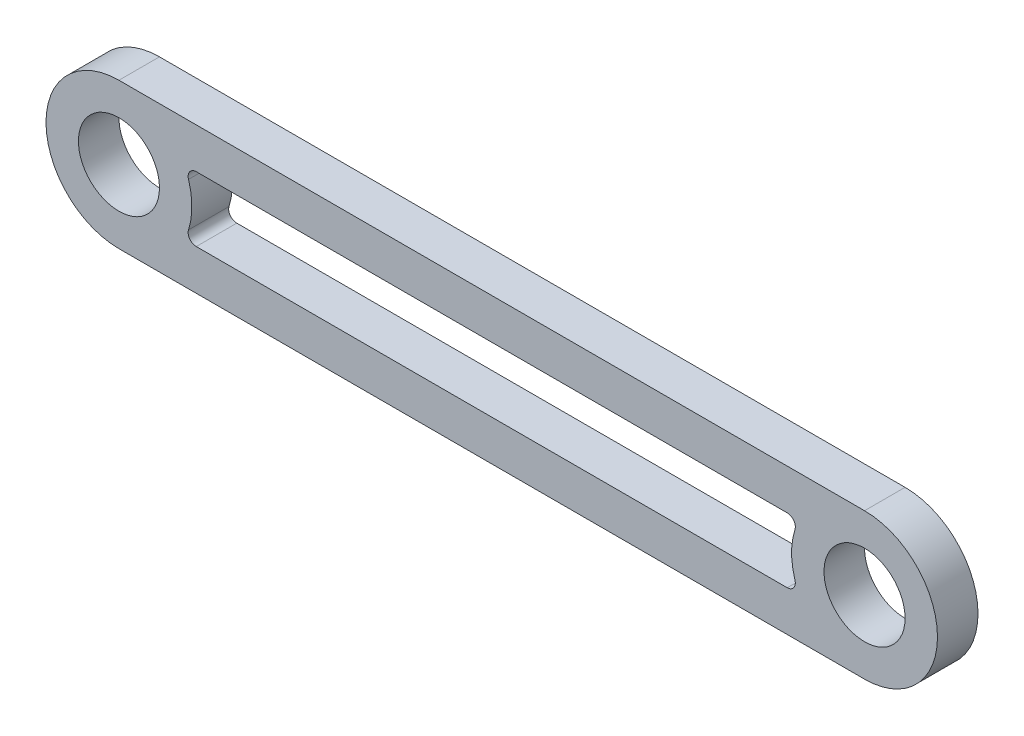
ISO-10303-21;
HEADER;
FILE_DESCRIPTION(('STEP AP214'),'2;1');
FILE_NAME('part.step','',(''),(''),'','','');
FILE_SCHEMA(('AUTOMOTIVE_DESIGN { 1 0 10303 214 1 1 1 1 }'));
ENDSEC;
DATA;
#1=APPLICATION_CONTEXT('core data for automotive mechanical design processes');
#2=APPLICATION_PROTOCOL_DEFINITION('international standard','automotive_design',2000,#1);
#3=PRODUCT_CONTEXT('',#1,'mechanical');
#4=PRODUCT('Part','Part','',(#3));
#5=PRODUCT_RELATED_PRODUCT_CATEGORY('part','',(#4));
#6=PRODUCT_DEFINITION_FORMATION('','',#4);
#7=PRODUCT_DEFINITION_CONTEXT('part definition',#1,'design');
#8=PRODUCT_DEFINITION('design','',#6,#7);
#9=PRODUCT_DEFINITION_SHAPE('','',#8);
#10=(LENGTH_UNIT() NAMED_UNIT(*) SI_UNIT(.MILLI.,.METRE.));
#11=(NAMED_UNIT(*) PLANE_ANGLE_UNIT() SI_UNIT($,.RADIAN.));
#12=(NAMED_UNIT(*) SI_UNIT($,.STERADIAN.) SOLID_ANGLE_UNIT());
#13=UNCERTAINTY_MEASURE_WITH_UNIT(LENGTH_MEASURE(1.E-05),#10,'distance_accuracy_value','');
#14=(GEOMETRIC_REPRESENTATION_CONTEXT(3) GLOBAL_UNCERTAINTY_ASSIGNED_CONTEXT((#13)) GLOBAL_UNIT_ASSIGNED_CONTEXT((#10,
#11,#12)) REPRESENTATION_CONTEXT('',''));
#15=CARTESIAN_POINT('',(0.,0.,0.));
#16=DIRECTION('',(0.,0.,1.));
#17=DIRECTION('',(1.,0.,0.));
#18=AXIS2_PLACEMENT_3D('',#15,#16,#17);
#19=CARTESIAN_POINT('',(0.,0.,5.));
#20=DIRECTION('',(0.,0.,1.));
#21=DIRECTION('',(1.,0.,0.));
#22=AXIS2_PLACEMENT_3D('',#19,#20,#21);
#23=PLANE('',#22);
#24=CARTESIAN_POINT('',(82.4606079858305,3.,5.));
#25=DIRECTION('',(0.,0.,1.));
#26=DIRECTION('',(-1.,0.,0.));
#27=AXIS2_PLACEMENT_3D('',#24,#25,#26);
#28=CIRCLE('',#27,0.999999999999997);
#29=CARTESIAN_POINT('',(83.4145471872475,2.7,5.));
#30=VERTEX_POINT('',#29);
#31=CARTESIAN_POINT('',(82.4606079858305,4.,5.));
#32=VERTEX_POINT('',#31);
#33=EDGE_CURVE('E55',#30,#32,#28,.T.);
#34=ORIENTED_EDGE('',*,*,#33,.F.);
#35=CARTESIAN_POINT('',(92.,0.,5.));
#36=DIRECTION('',(0.,0.,-1.));
#37=DIRECTION('',(1.,0.,0.));
#38=AXIS2_PLACEMENT_3D('',#35,#36,#37);
#39=CIRCLE('',#38,9.);
#40=CARTESIAN_POINT('',(83.4145471872475,-2.69999999999998,5.));
#41=VERTEX_POINT('',#40);
#42=EDGE_CURVE('E144',#41,#30,#39,.T.);
#43=ORIENTED_EDGE('',*,*,#42,.F.);
#44=CARTESIAN_POINT('',(82.4606079858305,-2.99999999999998,5.));
#45=DIRECTION('',(0.,0.,1.));
#46=DIRECTION('',(1.,0.,0.));
#47=AXIS2_PLACEMENT_3D('',#44,#45,#46);
#48=CIRCLE('',#47,0.999999999999996);
#49=CARTESIAN_POINT('',(82.4606079858305,-3.99999999999998,5.));
#50=VERTEX_POINT('',#49);
#51=EDGE_CURVE('E146',#50,#41,#48,.T.);
#52=ORIENTED_EDGE('',*,*,#51,.F.);
#53=DIRECTION('',(1.,0.,0.));
#54=VECTOR('',#53,1.);
#55=CARTESIAN_POINT('',(9.53939201416946,-4.,5.));
#56=LINE('',#55,#54);
#57=CARTESIAN_POINT('',(9.53939201416946,-4.,5.));
#58=VERTEX_POINT('',#57);
#59=EDGE_CURVE('E177',#58,#50,#56,.T.);
#60=ORIENTED_EDGE('',*,*,#59,.F.);
#61=CARTESIAN_POINT('',(9.53939201416946,-3.,5.));
#62=DIRECTION('',(0.,0.,1.));
#63=DIRECTION('',(-1.,0.,0.));
#64=AXIS2_PLACEMENT_3D('',#61,#62,#63);
#65=CIRCLE('',#64,0.999999999999999);
#66=CARTESIAN_POINT('',(8.58545281275251,-2.7,5.));
#67=VERTEX_POINT('',#66);
#68=EDGE_CURVE('E174',#67,#58,#65,.T.);
#69=ORIENTED_EDGE('',*,*,#68,.F.);
#70=CARTESIAN_POINT('',(0.,0.,5.));
#71=DIRECTION('',(0.,0.,-1.));
#72=DIRECTION('',(1.,0.,0.));
#73=AXIS2_PLACEMENT_3D('',#70,#71,#72);
#74=CIRCLE('',#73,9.);
#75=CARTESIAN_POINT('',(8.58545281275251,2.7,5.));
#76=VERTEX_POINT('',#75);
#77=EDGE_CURVE('E168',#76,#67,#74,.T.);
#78=ORIENTED_EDGE('',*,*,#77,.F.);
#79=CARTESIAN_POINT('',(9.53939201416946,3.,5.));
#80=DIRECTION('',(0.,0.,1.));
#81=DIRECTION('',(1.,0.,0.));
#82=AXIS2_PLACEMENT_3D('',#79,#80,#81);
#83=CIRCLE('',#82,0.999999999999999);
#84=CARTESIAN_POINT('',(9.53939201416946,4.,5.));
#85=VERTEX_POINT('',#84);
#86=EDGE_CURVE('E170',#85,#76,#83,.T.);
#87=ORIENTED_EDGE('',*,*,#86,.F.);
#88=DIRECTION('',(-1.,0.,0.));
#89=VECTOR('',#88,1.);
#90=CARTESIAN_POINT('',(9.53939201416946,4.,5.));
#91=LINE('',#90,#89);
#92=EDGE_CURVE('E164',#32,#85,#91,.T.);
#93=ORIENTED_EDGE('',*,*,#92,.F.);
#94=EDGE_LOOP('',(#34,#43,#52,#60,#69,#78,#87,#93));
#95=FACE_BOUND('',#94,.T.);
#96=CARTESIAN_POINT('',(0.,0.,5.));
#97=DIRECTION('',(0.,0.,1.));
#98=DIRECTION('',(1.,0.,0.));
#99=AXIS2_PLACEMENT_3D('',#96,#97,#98);
#100=CIRCLE('',#99,5.);
#101=CARTESIAN_POINT('',(5.,0.,5.));
#102=VERTEX_POINT('',#101);
#103=EDGE_CURVE('E203',#102,#102,#100,.T.);
#104=ORIENTED_EDGE('',*,*,#103,.F.);
#105=EDGE_LOOP('',(#104));
#106=FACE_BOUND('',#105,.T.);
#107=CARTESIAN_POINT('',(0.,0.,5.));
#108=DIRECTION('',(0.,0.,1.));
#109=DIRECTION('',(1.,0.,0.));
#110=AXIS2_PLACEMENT_3D('',#107,#108,#109);
#111=CIRCLE('',#110,9.);
#112=CARTESIAN_POINT('',(0.,9.,5.));
#113=VERTEX_POINT('',#112);
#114=CARTESIAN_POINT('',(0.,-9.,5.));
#115=VERTEX_POINT('',#114);
#116=EDGE_CURVE('E210',#113,#115,#111,.T.);
#117=ORIENTED_EDGE('',*,*,#116,.T.);
#118=DIRECTION('',(1.,0.,0.));
#119=VECTOR('',#118,1.);
#120=CARTESIAN_POINT('',(0.,-9.,5.));
#121=LINE('',#120,#119);
#122=CARTESIAN_POINT('',(92.,-9.,5.));
#123=VERTEX_POINT('',#122);
#124=EDGE_CURVE('E209',#115,#123,#121,.T.);
#125=ORIENTED_EDGE('',*,*,#124,.T.);
#126=CARTESIAN_POINT('',(92.,0.,5.));
#127=DIRECTION('',(0.,0.,1.));
#128=DIRECTION('',(1.,0.,0.));
#129=AXIS2_PLACEMENT_3D('',#126,#127,#128);
#130=CIRCLE('',#129,9.);
#131=CARTESIAN_POINT('',(92.,9.,5.));
#132=VERTEX_POINT('',#131);
#133=EDGE_CURVE('E213',#123,#132,#130,.T.);
#134=ORIENTED_EDGE('',*,*,#133,.T.);
#135=DIRECTION('',(-1.,0.,0.));
#136=VECTOR('',#135,1.);
#137=CARTESIAN_POINT('',(0.,9.,5.));
#138=LINE('',#137,#136);
#139=EDGE_CURVE('E214',#132,#113,#138,.T.);
#140=ORIENTED_EDGE('',*,*,#139,.T.);
#141=EDGE_LOOP('',(#117,#125,#134,#140));
#142=FACE_BOUND('',#141,.T.);
#143=CARTESIAN_POINT('',(92.,0.,5.));
#144=DIRECTION('',(0.,0.,1.));
#145=DIRECTION('',(1.,0.,0.));
#146=AXIS2_PLACEMENT_3D('',#143,#144,#145);
#147=CIRCLE('',#146,5.00000000000002);
#148=CARTESIAN_POINT('',(97.,0.,5.));
#149=VERTEX_POINT('',#148);
#150=EDGE_CURVE('E191',#149,#149,#147,.T.);
#151=ORIENTED_EDGE('',*,*,#150,.F.);
#152=EDGE_LOOP('',(#151));
#153=FACE_BOUND('',#152,.T.);
#154=ADVANCED_FACE('F40',(#95,#106,#142,#153),#23,.T.);
#155=CARTESIAN_POINT('',(0.,0.,0.));
#156=DIRECTION('',(0.,0.,1.));
#157=DIRECTION('',(1.,0.,0.));
#158=AXIS2_PLACEMENT_3D('',#155,#156,#157);
#159=PLANE('',#158);
#160=CARTESIAN_POINT('',(92.,0.,0.));
#161=DIRECTION('',(0.,0.,-1.));
#162=DIRECTION('',(1.,0.,0.));
#163=AXIS2_PLACEMENT_3D('',#160,#161,#162);
#164=CIRCLE('',#163,9.);
#165=CARTESIAN_POINT('',(83.4145471872475,-2.69999999999998,0.));
#166=VERTEX_POINT('',#165);
#167=CARTESIAN_POINT('',(83.4145471872475,2.7,0.));
#168=VERTEX_POINT('',#167);
#169=EDGE_CURVE('E131',#166,#168,#164,.T.);
#170=ORIENTED_EDGE('',*,*,#169,.T.);
#171=CARTESIAN_POINT('',(82.4606079858305,3.,0.));
#172=DIRECTION('',(0.,0.,1.));
#173=DIRECTION('',(-1.,0.,0.));
#174=AXIS2_PLACEMENT_3D('',#171,#172,#173);
#175=CIRCLE('',#174,0.999999999999997);
#176=CARTESIAN_POINT('',(82.4606079858305,4.,0.));
#177=VERTEX_POINT('',#176);
#178=EDGE_CURVE('E126',#168,#177,#175,.T.);
#179=ORIENTED_EDGE('',*,*,#178,.T.);
#180=DIRECTION('',(-1.,0.,0.));
#181=VECTOR('',#180,1.);
#182=CARTESIAN_POINT('',(9.53939201416946,4.,0.));
#183=LINE('',#182,#181);
#184=CARTESIAN_POINT('',(9.53939201416946,4.,0.));
#185=VERTEX_POINT('',#184);
#186=EDGE_CURVE('E140',#177,#185,#183,.T.);
#187=ORIENTED_EDGE('',*,*,#186,.T.);
#188=CARTESIAN_POINT('',(9.53939201416946,3.,0.));
#189=DIRECTION('',(0.,0.,1.));
#190=DIRECTION('',(1.,0.,0.));
#191=AXIS2_PLACEMENT_3D('',#188,#189,#190);
#192=CIRCLE('',#191,0.999999999999999);
#193=CARTESIAN_POINT('',(8.58545281275251,2.7,0.));
#194=VERTEX_POINT('',#193);
#195=EDGE_CURVE('E58',#185,#194,#192,.T.);
#196=ORIENTED_EDGE('',*,*,#195,.T.);
#197=CARTESIAN_POINT('',(0.,0.,0.));
#198=DIRECTION('',(0.,0.,-1.));
#199=DIRECTION('',(1.,0.,0.));
#200=AXIS2_PLACEMENT_3D('',#197,#198,#199);
#201=CIRCLE('',#200,9.);
#202=CARTESIAN_POINT('',(8.58545281275251,-2.7,0.));
#203=VERTEX_POINT('',#202);
#204=EDGE_CURVE('E155',#194,#203,#201,.T.);
#205=ORIENTED_EDGE('',*,*,#204,.T.);
#206=CARTESIAN_POINT('',(9.53939201416946,-3.,0.));
#207=DIRECTION('',(0.,0.,1.));
#208=DIRECTION('',(-1.,0.,0.));
#209=AXIS2_PLACEMENT_3D('',#206,#207,#208);
#210=CIRCLE('',#209,0.999999999999999);
#211=CARTESIAN_POINT('',(9.53939201416946,-4.,0.));
#212=VERTEX_POINT('',#211);
#213=EDGE_CURVE('E154',#203,#212,#210,.T.);
#214=ORIENTED_EDGE('',*,*,#213,.T.);
#215=DIRECTION('',(1.,0.,0.));
#216=VECTOR('',#215,1.);
#217=CARTESIAN_POINT('',(9.53939201416946,-4.,0.));
#218=LINE('',#217,#216);
#219=CARTESIAN_POINT('',(82.4606079858305,-3.99999999999998,0.));
#220=VERTEX_POINT('',#219);
#221=EDGE_CURVE('E158',#212,#220,#218,.T.);
#222=ORIENTED_EDGE('',*,*,#221,.T.);
#223=CARTESIAN_POINT('',(82.4606079858305,-2.99999999999998,0.));
#224=DIRECTION('',(0.,0.,1.));
#225=DIRECTION('',(1.,0.,0.));
#226=AXIS2_PLACEMENT_3D('',#223,#224,#225);
#227=CIRCLE('',#226,0.999999999999996);
#228=EDGE_CURVE('E161',#220,#166,#227,.T.);
#229=ORIENTED_EDGE('',*,*,#228,.T.);
#230=EDGE_LOOP('',(#170,#179,#187,#196,#205,#214,#222,#229));
#231=FACE_BOUND('',#230,.T.);
#232=CARTESIAN_POINT('',(0.,0.,0.));
#233=DIRECTION('',(0.,0.,1.));
#234=DIRECTION('',(1.,0.,0.));
#235=AXIS2_PLACEMENT_3D('',#232,#233,#234);
#236=CIRCLE('',#235,9.);
#237=CARTESIAN_POINT('',(0.,9.,0.));
#238=VERTEX_POINT('',#237);
#239=CARTESIAN_POINT('',(0.,-9.,0.));
#240=VERTEX_POINT('',#239);
#241=EDGE_CURVE('E204',#238,#240,#236,.T.);
#242=ORIENTED_EDGE('',*,*,#241,.F.);
#243=DIRECTION('',(-1.,0.,0.));
#244=VECTOR('',#243,1.);
#245=CARTESIAN_POINT('',(0.,9.,0.));
#246=LINE('',#245,#244);
#247=CARTESIAN_POINT('',(92.,9.,0.));
#248=VERTEX_POINT('',#247);
#249=EDGE_CURVE('E211',#248,#238,#246,.T.);
#250=ORIENTED_EDGE('',*,*,#249,.F.);
#251=CARTESIAN_POINT('',(92.,0.,0.));
#252=DIRECTION('',(0.,0.,1.));
#253=DIRECTION('',(1.,0.,0.));
#254=AXIS2_PLACEMENT_3D('',#251,#252,#253);
#255=CIRCLE('',#254,9.);
#256=CARTESIAN_POINT('',(92.,-9.,0.));
#257=VERTEX_POINT('',#256);
#258=EDGE_CURVE('E225',#257,#248,#255,.T.);
#259=ORIENTED_EDGE('',*,*,#258,.F.);
#260=DIRECTION('',(1.,0.,0.));
#261=VECTOR('',#260,1.);
#262=CARTESIAN_POINT('',(0.,-9.,0.));
#263=LINE('',#262,#261);
#264=EDGE_CURVE('E219',#240,#257,#263,.T.);
#265=ORIENTED_EDGE('',*,*,#264,.F.);
#266=EDGE_LOOP('',(#242,#250,#259,#265));
#267=FACE_BOUND('',#266,.T.);
#268=CARTESIAN_POINT('',(0.,0.,0.));
#269=DIRECTION('',(0.,0.,1.));
#270=DIRECTION('',(1.,0.,0.));
#271=AXIS2_PLACEMENT_3D('',#268,#269,#270);
#272=CIRCLE('',#271,5.);
#273=CARTESIAN_POINT('',(5.,0.,0.));
#274=VERTEX_POINT('',#273);
#275=EDGE_CURVE('E196',#274,#274,#272,.T.);
#276=ORIENTED_EDGE('',*,*,#275,.T.);
#277=EDGE_LOOP('',(#276));
#278=FACE_BOUND('',#277,.T.);
#279=CARTESIAN_POINT('',(92.,0.,0.));
#280=DIRECTION('',(0.,0.,1.));
#281=DIRECTION('',(1.,0.,0.));
#282=AXIS2_PLACEMENT_3D('',#279,#280,#281);
#283=CIRCLE('',#282,5.00000000000002);
#284=CARTESIAN_POINT('',(97.,0.,0.));
#285=VERTEX_POINT('',#284);
#286=EDGE_CURVE('E181',#285,#285,#283,.T.);
#287=ORIENTED_EDGE('',*,*,#286,.T.);
#288=EDGE_LOOP('',(#287));
#289=FACE_BOUND('',#288,.T.);
#290=ADVANCED_FACE('F143',(#231,#267,#278,#289),#159,.F.);
#291=CARTESIAN_POINT('',(0.,0.,5.));
#292=DIRECTION('',(0.,0.,-1.));
#293=DIRECTION('',(-1.,0.,0.));
#294=AXIS2_PLACEMENT_3D('',#291,#292,#293);
#295=CYLINDRICAL_SURFACE('',#294,9.);
#296=ORIENTED_EDGE('',*,*,#241,.T.);
#297=DIRECTION('',(0.,0.,-1.));
#298=VECTOR('',#297,1.);
#299=CARTESIAN_POINT('',(0.,-9.,5.));
#300=LINE('',#299,#298);
#301=EDGE_CURVE('E11',#115,#240,#300,.T.);
#302=ORIENTED_EDGE('',*,*,#301,.F.);
#303=ORIENTED_EDGE('',*,*,#116,.F.);
#304=DIRECTION('',(0.,0.,-1.));
#305=VECTOR('',#304,1.);
#306=CARTESIAN_POINT('',(0.,9.,5.));
#307=LINE('',#306,#305);
#308=EDGE_CURVE('E220',#113,#238,#307,.T.);
#309=ORIENTED_EDGE('',*,*,#308,.T.);
#310=EDGE_LOOP('',(#296,#302,#303,#309));
#311=FACE_BOUND('',#310,.T.);
#312=ADVANCED_FACE('F39',(#311),#295,.T.);
#313=CARTESIAN_POINT('',(0.,-9.,5.));
#314=DIRECTION('',(0.,1.,0.));
#315=DIRECTION('',(0.,0.,1.));
#316=AXIS2_PLACEMENT_3D('',#313,#314,#315);
#317=PLANE('',#316);
#318=ORIENTED_EDGE('',*,*,#264,.T.);
#319=DIRECTION('',(0.,0.,-1.));
#320=VECTOR('',#319,1.);
#321=CARTESIAN_POINT('',(92.,-9.,5.));
#322=LINE('',#321,#320);
#323=EDGE_CURVE('E44',#123,#257,#322,.T.);
#324=ORIENTED_EDGE('',*,*,#323,.F.);
#325=ORIENTED_EDGE('',*,*,#124,.F.);
#326=ORIENTED_EDGE('',*,*,#301,.T.);
#327=EDGE_LOOP('',(#318,#324,#325,#326));
#328=FACE_BOUND('',#327,.T.);
#329=ADVANCED_FACE('F249',(#328),#317,.F.);
#330=CARTESIAN_POINT('',(92.,0.,5.));
#331=DIRECTION('',(0.,0.,-1.));
#332=DIRECTION('',(-1.,0.,0.));
#333=AXIS2_PLACEMENT_3D('',#330,#331,#332);
#334=CYLINDRICAL_SURFACE('',#333,9.);
#335=ORIENTED_EDGE('',*,*,#258,.T.);
#336=DIRECTION('',(0.,0.,-1.));
#337=VECTOR('',#336,1.);
#338=CARTESIAN_POINT('',(92.,9.,5.));
#339=LINE('',#338,#337);
#340=EDGE_CURVE('E230',#132,#248,#339,.T.);
#341=ORIENTED_EDGE('',*,*,#340,.F.);
#342=ORIENTED_EDGE('',*,*,#133,.F.);
#343=ORIENTED_EDGE('',*,*,#323,.T.);
#344=EDGE_LOOP('',(#335,#341,#342,#343));
#345=FACE_BOUND('',#344,.T.);
#346=ADVANCED_FACE('F234',(#345),#334,.T.);
#347=CARTESIAN_POINT('',(0.,9.,5.));
#348=DIRECTION('',(0.,-1.,0.));
#349=DIRECTION('',(0.,0.,-1.));
#350=AXIS2_PLACEMENT_3D('',#347,#348,#349);
#351=PLANE('',#350);
#352=ORIENTED_EDGE('',*,*,#249,.T.);
#353=ORIENTED_EDGE('',*,*,#308,.F.);
#354=ORIENTED_EDGE('',*,*,#139,.F.);
#355=ORIENTED_EDGE('',*,*,#340,.T.);
#356=EDGE_LOOP('',(#352,#353,#354,#355));
#357=FACE_BOUND('',#356,.T.);
#358=ADVANCED_FACE('F245',(#357),#351,.F.);
#359=CARTESIAN_POINT('',(0.,0.,5.));
#360=DIRECTION('',(0.,0.,-1.));
#361=DIRECTION('',(-1.,0.,0.));
#362=AXIS2_PLACEMENT_3D('',#359,#360,#361);
#363=CYLINDRICAL_SURFACE('',#362,5.);
#364=ORIENTED_EDGE('',*,*,#103,.T.);
#365=EDGE_LOOP('',(#364));
#366=FACE_BOUND('',#365,.T.);
#367=ORIENTED_EDGE('',*,*,#275,.F.);
#368=EDGE_LOOP('',(#367));
#369=FACE_BOUND('',#368,.T.);
#370=ADVANCED_FACE('F266',(#366,#369),#363,.F.);
#371=CARTESIAN_POINT('',(92.,0.,5.));
#372=DIRECTION('',(0.,0.,-1.));
#373=DIRECTION('',(-1.,0.,0.));
#374=AXIS2_PLACEMENT_3D('',#371,#372,#373);
#375=CYLINDRICAL_SURFACE('',#374,5.00000000000002);
#376=ORIENTED_EDGE('',*,*,#150,.T.);
#377=EDGE_LOOP('',(#376));
#378=FACE_BOUND('',#377,.T.);
#379=ORIENTED_EDGE('',*,*,#286,.F.);
#380=EDGE_LOOP('',(#379));
#381=FACE_BOUND('',#380,.T.);
#382=ADVANCED_FACE('F272',(#378,#381),#375,.F.);
#383=CARTESIAN_POINT('',(82.4606079858305,3.,0.));
#384=DIRECTION('',(0.,0.,1.));
#385=DIRECTION('',(1.,0.,0.));
#386=AXIS2_PLACEMENT_3D('',#383,#384,#385);
#387=CYLINDRICAL_SURFACE('',#386,0.999999999999997);
#388=ORIENTED_EDGE('',*,*,#33,.T.);
#389=DIRECTION('',(0.,0.,1.));
#390=VECTOR('',#389,1.);
#391=CARTESIAN_POINT('',(82.4606079858305,4.,0.));
#392=LINE('',#391,#390);
#393=EDGE_CURVE('E124',#177,#32,#392,.T.);
#394=ORIENTED_EDGE('',*,*,#393,.F.);
#395=ORIENTED_EDGE('',*,*,#178,.F.);
#396=DIRECTION('',(0.,0.,1.));
#397=VECTOR('',#396,1.);
#398=CARTESIAN_POINT('',(83.4145471872475,2.7,0.));
#399=LINE('',#398,#397);
#400=EDGE_CURVE('E182',#168,#30,#399,.T.);
#401=ORIENTED_EDGE('',*,*,#400,.T.);
#402=EDGE_LOOP('',(#388,#394,#395,#401));
#403=FACE_BOUND('',#402,.T.);
#404=ADVANCED_FACE('F127',(#403),#387,.F.);
#405=CARTESIAN_POINT('',(92.,0.,0.));
#406=DIRECTION('',(0.,0.,1.));
#407=DIRECTION('',(1.,0.,0.));
#408=AXIS2_PLACEMENT_3D('',#405,#406,#407);
#409=CYLINDRICAL_SURFACE('',#408,9.);
#410=ORIENTED_EDGE('',*,*,#42,.T.);
#411=ORIENTED_EDGE('',*,*,#400,.F.);
#412=ORIENTED_EDGE('',*,*,#169,.F.);
#413=DIRECTION('',(0.,0.,1.));
#414=VECTOR('',#413,1.);
#415=CARTESIAN_POINT('',(83.4145471872475,-2.69999999999998,0.));
#416=LINE('',#415,#414);
#417=EDGE_CURVE('E184',#166,#41,#416,.T.);
#418=ORIENTED_EDGE('',*,*,#417,.T.);
#419=EDGE_LOOP('',(#410,#411,#412,#418));
#420=FACE_BOUND('',#419,.T.);
#421=ADVANCED_FACE('F290',(#420),#409,.T.);
#422=CARTESIAN_POINT('',(82.4606079858305,-2.99999999999998,0.));
#423=DIRECTION('',(0.,0.,1.));
#424=DIRECTION('',(1.,0.,0.));
#425=AXIS2_PLACEMENT_3D('',#422,#423,#424);
#426=CYLINDRICAL_SURFACE('',#425,0.999999999999996);
#427=ORIENTED_EDGE('',*,*,#51,.T.);
#428=ORIENTED_EDGE('',*,*,#417,.F.);
#429=ORIENTED_EDGE('',*,*,#228,.F.);
#430=DIRECTION('',(0.,0.,1.));
#431=VECTOR('',#430,1.);
#432=CARTESIAN_POINT('',(82.4606079858305,-3.99999999999998,0.));
#433=LINE('',#432,#431);
#434=EDGE_CURVE('E187',#220,#50,#433,.T.);
#435=ORIENTED_EDGE('',*,*,#434,.T.);
#436=EDGE_LOOP('',(#427,#428,#429,#435));
#437=FACE_BOUND('',#436,.T.);
#438=ADVANCED_FACE('F308',(#437),#426,.F.);
#439=CARTESIAN_POINT('',(9.53939201416946,-4.,0.));
#440=DIRECTION('',(0.,-1.,0.));
#441=DIRECTION('',(1.,0.,0.));
#442=AXIS2_PLACEMENT_3D('',#439,#440,#441);
#443=PLANE('',#442);
#444=ORIENTED_EDGE('',*,*,#59,.T.);
#445=ORIENTED_EDGE('',*,*,#434,.F.);
#446=ORIENTED_EDGE('',*,*,#221,.F.);
#447=DIRECTION('',(0.,0.,1.));
#448=VECTOR('',#447,1.);
#449=CARTESIAN_POINT('',(9.53939201416946,-4.,0.));
#450=LINE('',#449,#448);
#451=EDGE_CURVE('E189',#212,#58,#450,.T.);
#452=ORIENTED_EDGE('',*,*,#451,.T.);
#453=EDGE_LOOP('',(#444,#445,#446,#452));
#454=FACE_BOUND('',#453,.T.);
#455=ADVANCED_FACE('F305',(#454),#443,.F.);
#456=CARTESIAN_POINT('',(9.53939201416946,-3.,0.));
#457=DIRECTION('',(0.,0.,1.));
#458=DIRECTION('',(1.,0.,0.));
#459=AXIS2_PLACEMENT_3D('',#456,#457,#458);
#460=CYLINDRICAL_SURFACE('',#459,0.999999999999999);
#461=ORIENTED_EDGE('',*,*,#68,.T.);
#462=ORIENTED_EDGE('',*,*,#451,.F.);
#463=ORIENTED_EDGE('',*,*,#213,.F.);
#464=DIRECTION('',(0.,0.,1.));
#465=VECTOR('',#464,1.);
#466=CARTESIAN_POINT('',(8.58545281275251,-2.7,0.));
#467=LINE('',#466,#465);
#468=EDGE_CURVE('E188',#203,#67,#467,.T.);
#469=ORIENTED_EDGE('',*,*,#468,.T.);
#470=EDGE_LOOP('',(#461,#462,#463,#469));
#471=FACE_BOUND('',#470,.T.);
#472=ADVANCED_FACE('F299',(#471),#460,.F.);
#473=CARTESIAN_POINT('',(0.,0.,0.));
#474=DIRECTION('',(0.,0.,1.));
#475=DIRECTION('',(1.,0.,0.));
#476=AXIS2_PLACEMENT_3D('',#473,#474,#475);
#477=CYLINDRICAL_SURFACE('',#476,9.);
#478=ORIENTED_EDGE('',*,*,#77,.T.);
#479=ORIENTED_EDGE('',*,*,#468,.F.);
#480=ORIENTED_EDGE('',*,*,#204,.F.);
#481=DIRECTION('',(0.,0.,1.));
#482=VECTOR('',#481,1.);
#483=CARTESIAN_POINT('',(8.58545281275251,2.7,0.));
#484=LINE('',#483,#482);
#485=EDGE_CURVE('E195',#194,#76,#484,.T.);
#486=ORIENTED_EDGE('',*,*,#485,.T.);
#487=EDGE_LOOP('',(#478,#479,#480,#486));
#488=FACE_BOUND('',#487,.T.);
#489=ADVANCED_FACE('F293',(#488),#477,.T.);
#490=CARTESIAN_POINT('',(9.53939201416946,3.,0.));
#491=DIRECTION('',(0.,0.,1.));
#492=DIRECTION('',(1.,0.,0.));
#493=AXIS2_PLACEMENT_3D('',#490,#491,#492);
#494=CYLINDRICAL_SURFACE('',#493,0.999999999999999);
#495=ORIENTED_EDGE('',*,*,#86,.T.);
#496=ORIENTED_EDGE('',*,*,#485,.F.);
#497=ORIENTED_EDGE('',*,*,#195,.F.);
#498=DIRECTION('',(0.,0.,1.));
#499=VECTOR('',#498,1.);
#500=CARTESIAN_POINT('',(9.53939201416946,4.,0.));
#501=LINE('',#500,#499);
#502=EDGE_CURVE('E134',#185,#85,#501,.T.);
#503=ORIENTED_EDGE('',*,*,#502,.T.);
#504=EDGE_LOOP('',(#495,#496,#497,#503));
#505=FACE_BOUND('',#504,.T.);
#506=ADVANCED_FACE('F295',(#505),#494,.F.);
#507=CARTESIAN_POINT('',(9.53939201416946,4.,0.));
#508=DIRECTION('',(0.,1.,0.));
#509=DIRECTION('',(-1.,0.,0.));
#510=AXIS2_PLACEMENT_3D('',#507,#508,#509);
#511=PLANE('',#510);
#512=ORIENTED_EDGE('',*,*,#92,.T.);
#513=ORIENTED_EDGE('',*,*,#502,.F.);
#514=ORIENTED_EDGE('',*,*,#186,.F.);
#515=ORIENTED_EDGE('',*,*,#393,.T.);
#516=EDGE_LOOP('',(#512,#513,#514,#515));
#517=FACE_BOUND('',#516,.T.);
#518=ADVANCED_FACE('F138',(#517),#511,.F.);
#519=CLOSED_SHELL('',(#154,#290,#312,#329,#346,#358,#370,#382,#404,#421,#438,#455,#472,#489,
#506,#518));
#520=MANIFOLD_SOLID_BREP('B2',#519);
#521=ADVANCED_BREP_SHAPE_REPRESENTATION('',(#18,#520),#14);
#522=SHAPE_DEFINITION_REPRESENTATION(#9,#521);
ENDSEC;
END-ISO-10303-21;
